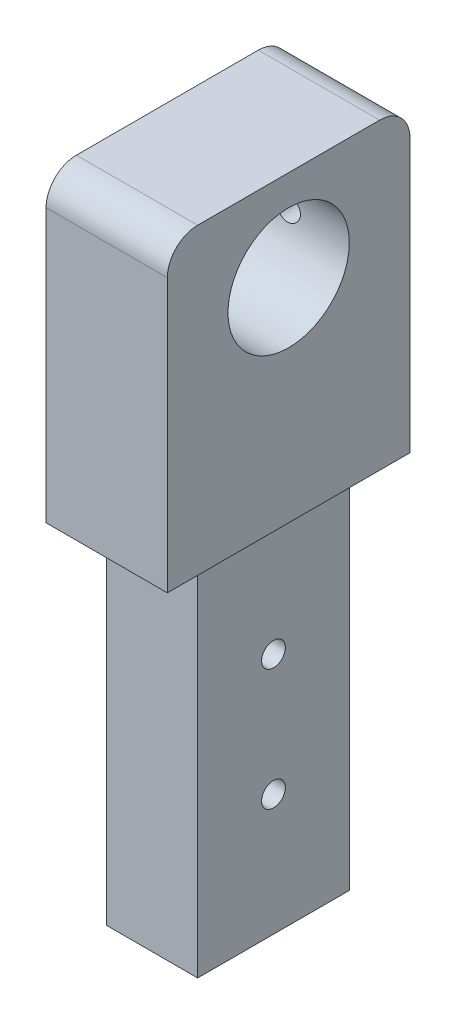
ISO-10303-21;
HEADER;
FILE_DESCRIPTION(('STEP AP214'),'2;1');
FILE_NAME('part.step','',(''),(''),'','','');
FILE_SCHEMA(('AUTOMOTIVE_DESIGN { 1 0 10303 214 1 1 1 1 }'));
ENDSEC;
DATA;
#1=APPLICATION_CONTEXT('core data for automotive mechanical design processes');
#2=APPLICATION_PROTOCOL_DEFINITION('international standard','automotive_design',2000,#1);
#3=PRODUCT_CONTEXT('',#1,'mechanical');
#4=PRODUCT('Part','Part','',(#3));
#5=PRODUCT_RELATED_PRODUCT_CATEGORY('part','',(#4));
#6=PRODUCT_DEFINITION_FORMATION('','',#4);
#7=PRODUCT_DEFINITION_CONTEXT('part definition',#1,'design');
#8=PRODUCT_DEFINITION('design','',#6,#7);
#9=PRODUCT_DEFINITION_SHAPE('','',#8);
#10=(LENGTH_UNIT() NAMED_UNIT(*) SI_UNIT(.MILLI.,.METRE.));
#11=(NAMED_UNIT(*) PLANE_ANGLE_UNIT() SI_UNIT($,.RADIAN.));
#12=(NAMED_UNIT(*) SI_UNIT($,.STERADIAN.) SOLID_ANGLE_UNIT());
#13=UNCERTAINTY_MEASURE_WITH_UNIT(LENGTH_MEASURE(1.E-05),#10,'distance_accuracy_value','');
#14=(GEOMETRIC_REPRESENTATION_CONTEXT(3) GLOBAL_UNCERTAINTY_ASSIGNED_CONTEXT((#13)) GLOBAL_UNIT_ASSIGNED_CONTEXT((#10,
#11,#12)) REPRESENTATION_CONTEXT('',''));
#15=CARTESIAN_POINT('',(0.,0.,0.));
#16=DIRECTION('',(0.,0.,1.));
#17=DIRECTION('',(1.,0.,0.));
#18=AXIS2_PLACEMENT_3D('',#15,#16,#17);
#19=CARTESIAN_POINT('',(9.525,76.2,15.875));
#20=DIRECTION('',(-1.,0.,0.));
#21=DIRECTION('',(0.,0.,1.));
#22=AXIS2_PLACEMENT_3D('',#19,#20,#21);
#23=PLANE('',#22);
#24=CARTESIAN_POINT('',(9.525,25.4,0.));
#25=DIRECTION('',(-1.,0.,0.));
#26=DIRECTION('',(0.,0.,1.));
#27=AXIS2_PLACEMENT_3D('',#24,#25,#26);
#28=CIRCLE('',#27,2.4892);
#29=CARTESIAN_POINT('',(9.525,25.4,2.4892));
#30=VERTEX_POINT('',#29);
#31=EDGE_CURVE('E302',#30,#30,#28,.F.);
#32=ORIENTED_EDGE('',*,*,#31,.F.);
#33=EDGE_LOOP('',(#32));
#34=FACE_BOUND('',#33,.T.);
#35=CARTESIAN_POINT('',(9.525,50.8,0.));
#36=DIRECTION('',(-1.,0.,0.));
#37=DIRECTION('',(0.,0.,1.));
#38=AXIS2_PLACEMENT_3D('',#35,#36,#37);
#39=CIRCLE('',#38,2.4892);
#40=CARTESIAN_POINT('',(9.525,50.8,2.4892));
#41=VERTEX_POINT('',#40);
#42=EDGE_CURVE('E297',#41,#41,#39,.F.);
#43=ORIENTED_EDGE('',*,*,#42,.F.);
#44=EDGE_LOOP('',(#43));
#45=FACE_BOUND('',#44,.T.);
#46=DIRECTION('',(0.,0.,-1.));
#47=VECTOR('',#46,1.);
#48=CARTESIAN_POINT('',(9.525,0.,15.875));
#49=LINE('',#48,#47);
#50=CARTESIAN_POINT('',(9.525,0.,15.875));
#51=VERTEX_POINT('',#50);
#52=CARTESIAN_POINT('',(9.525,0.,-15.875));
#53=VERTEX_POINT('',#52);
#54=EDGE_CURVE('E121',#51,#53,#49,.T.);
#55=ORIENTED_EDGE('',*,*,#54,.T.);
#56=DIRECTION('',(0.,-1.,0.));
#57=VECTOR('',#56,1.);
#58=CARTESIAN_POINT('',(9.525,76.2,-15.875));
#59=LINE('',#58,#57);
#60=CARTESIAN_POINT('',(9.525,76.2,-15.875));
#61=VERTEX_POINT('',#60);
#62=EDGE_CURVE('E182',#61,#53,#59,.T.);
#63=ORIENTED_EDGE('',*,*,#62,.F.);
#64=DIRECTION('',(0.,0.,-1.));
#65=VECTOR('',#64,1.);
#66=CARTESIAN_POINT('',(9.525,76.2,15.875));
#67=LINE('',#66,#65);
#68=CARTESIAN_POINT('',(9.525,76.2,15.875));
#69=VERTEX_POINT('',#68);
#70=EDGE_CURVE('E153',#69,#61,#67,.T.);
#71=ORIENTED_EDGE('',*,*,#70,.F.);
#72=DIRECTION('',(0.,-1.,0.));
#73=VECTOR('',#72,1.);
#74=CARTESIAN_POINT('',(9.525,76.2,15.875));
#75=LINE('',#74,#73);
#76=EDGE_CURVE('E166',#69,#51,#75,.T.);
#77=ORIENTED_EDGE('',*,*,#76,.T.);
#78=EDGE_LOOP('',(#55,#63,#71,#77));
#79=FACE_BOUND('',#78,.T.);
#80=ADVANCED_FACE('F39',(#34,#45,#79),#23,.F.);
#81=CARTESIAN_POINT('',(-9.525,76.2,-15.875));
#82=DIRECTION('',(0.,0.,1.));
#83=DIRECTION('',(1.,0.,0.));
#84=AXIS2_PLACEMENT_3D('',#81,#82,#83);
#85=PLANE('',#84);
#86=DIRECTION('',(-1.,0.,0.));
#87=VECTOR('',#86,1.);
#88=CARTESIAN_POINT('',(-9.525,0.,-15.875));
#89=LINE('',#88,#87);
#90=CARTESIAN_POINT('',(-9.525,0.,-15.875));
#91=VERTEX_POINT('',#90);
#92=EDGE_CURVE('E169',#53,#91,#89,.T.);
#93=ORIENTED_EDGE('',*,*,#92,.T.);
#94=DIRECTION('',(0.,-1.,0.));
#95=VECTOR('',#94,1.);
#96=CARTESIAN_POINT('',(-9.525,76.2,-15.875));
#97=LINE('',#96,#95);
#98=CARTESIAN_POINT('',(-9.525,76.2,-15.875));
#99=VERTEX_POINT('',#98);
#100=EDGE_CURVE('E179',#99,#91,#97,.T.);
#101=ORIENTED_EDGE('',*,*,#100,.F.);
#102=DIRECTION('',(-1.,0.,0.));
#103=VECTOR('',#102,1.);
#104=CARTESIAN_POINT('',(-9.525,76.2,-15.875));
#105=LINE('',#104,#103);
#106=EDGE_CURVE('E156',#61,#99,#105,.T.);
#107=ORIENTED_EDGE('',*,*,#106,.F.);
#108=ORIENTED_EDGE('',*,*,#62,.T.);
#109=EDGE_LOOP('',(#93,#101,#107,#108));
#110=FACE_BOUND('',#109,.T.);
#111=ADVANCED_FACE('F225',(#110),#85,.F.);
#112=CARTESIAN_POINT('',(-9.525,76.2,15.875));
#113=DIRECTION('',(1.,0.,0.));
#114=DIRECTION('',(0.,0.,-1.));
#115=AXIS2_PLACEMENT_3D('',#112,#113,#114);
#116=PLANE('',#115);
#117=CARTESIAN_POINT('',(-9.525,25.4,0.));
#118=DIRECTION('',(-1.,0.,0.));
#119=DIRECTION('',(0.,0.,1.));
#120=AXIS2_PLACEMENT_3D('',#117,#118,#119);
#121=CIRCLE('',#120,2.4892);
#122=CARTESIAN_POINT('',(-9.525,25.4,2.4892));
#123=VERTEX_POINT('',#122);
#124=EDGE_CURVE('E284',#123,#123,#121,.T.);
#125=ORIENTED_EDGE('',*,*,#124,.F.);
#126=EDGE_LOOP('',(#125));
#127=FACE_BOUND('',#126,.T.);
#128=CARTESIAN_POINT('',(-9.525,50.8,0.));
#129=DIRECTION('',(-1.,0.,0.));
#130=DIRECTION('',(0.,0.,1.));
#131=AXIS2_PLACEMENT_3D('',#128,#129,#130);
#132=CIRCLE('',#131,2.4892);
#133=CARTESIAN_POINT('',(-9.525,50.8,2.4892));
#134=VERTEX_POINT('',#133);
#135=EDGE_CURVE('E288',#134,#134,#132,.T.);
#136=ORIENTED_EDGE('',*,*,#135,.F.);
#137=EDGE_LOOP('',(#136));
#138=FACE_BOUND('',#137,.T.);
#139=DIRECTION('',(0.,0.,1.));
#140=VECTOR('',#139,1.);
#141=CARTESIAN_POINT('',(-9.525,0.,15.875));
#142=LINE('',#141,#140);
#143=CARTESIAN_POINT('',(-9.525,0.,15.875));
#144=VERTEX_POINT('',#143);
#145=EDGE_CURVE('E171',#91,#144,#142,.T.);
#146=ORIENTED_EDGE('',*,*,#145,.T.);
#147=DIRECTION('',(0.,-1.,0.));
#148=VECTOR('',#147,1.);
#149=CARTESIAN_POINT('',(-9.525,76.2,15.875));
#150=LINE('',#149,#148);
#151=CARTESIAN_POINT('',(-9.525,76.2,15.875));
#152=VERTEX_POINT('',#151);
#153=EDGE_CURVE('E176',#152,#144,#150,.T.);
#154=ORIENTED_EDGE('',*,*,#153,.F.);
#155=DIRECTION('',(0.,0.,1.));
#156=VECTOR('',#155,1.);
#157=CARTESIAN_POINT('',(-9.525,76.2,15.875));
#158=LINE('',#157,#156);
#159=EDGE_CURVE('E160',#99,#152,#158,.T.);
#160=ORIENTED_EDGE('',*,*,#159,.F.);
#161=ORIENTED_EDGE('',*,*,#100,.T.);
#162=EDGE_LOOP('',(#146,#154,#160,#161));
#163=FACE_BOUND('',#162,.T.);
#164=ADVANCED_FACE('F233',(#127,#138,#163),#116,.F.);
#165=CARTESIAN_POINT('',(-9.525,76.2,15.875));
#166=DIRECTION('',(0.,0.,-1.));
#167=DIRECTION('',(-1.,0.,0.));
#168=AXIS2_PLACEMENT_3D('',#165,#166,#167);
#169=PLANE('',#168);
#170=DIRECTION('',(1.,0.,0.));
#171=VECTOR('',#170,1.);
#172=CARTESIAN_POINT('',(-9.525,0.,15.875));
#173=LINE('',#172,#171);
#174=EDGE_CURVE('E157',#144,#51,#173,.T.);
#175=ORIENTED_EDGE('',*,*,#174,.T.);
#176=ORIENTED_EDGE('',*,*,#76,.F.);
#177=DIRECTION('',(1.,0.,0.));
#178=VECTOR('',#177,1.);
#179=CARTESIAN_POINT('',(-9.525,76.2,15.875));
#180=LINE('',#179,#178);
#181=EDGE_CURVE('E163',#152,#69,#180,.T.);
#182=ORIENTED_EDGE('',*,*,#181,.F.);
#183=ORIENTED_EDGE('',*,*,#153,.T.);
#184=EDGE_LOOP('',(#175,#176,#182,#183));
#185=FACE_BOUND('',#184,.T.);
#186=ADVANCED_FACE('F268',(#185),#169,.F.);
#187=CARTESIAN_POINT('',(0.,0.,0.));
#188=DIRECTION('',(0.,-1.,0.));
#189=DIRECTION('',(0.,0.,-1.));
#190=AXIS2_PLACEMENT_3D('',#187,#188,#189);
#191=PLANE('',#190);
#192=ORIENTED_EDGE('',*,*,#54,.F.);
#193=ORIENTED_EDGE('',*,*,#174,.F.);
#194=ORIENTED_EDGE('',*,*,#145,.F.);
#195=ORIENTED_EDGE('',*,*,#92,.F.);
#196=EDGE_LOOP('',(#192,#193,#194,#195));
#197=FACE_BOUND('',#196,.T.);
#198=ADVANCED_FACE('F261',(#197),#191,.T.);
#199=CARTESIAN_POINT('',(0.,76.2,0.));
#200=DIRECTION('',(0.,-1.,0.));
#201=DIRECTION('',(0.,0.,-1.));
#202=AXIS2_PLACEMENT_3D('',#199,#200,#201);
#203=PLANE('',#202);
#204=DIRECTION('',(0.,0.,-1.));
#205=VECTOR('',#204,1.);
#206=CARTESIAN_POINT('',(12.7,76.2,25.4));
#207=LINE('',#206,#205);
#208=CARTESIAN_POINT('',(12.7,76.2,25.4));
#209=VERTEX_POINT('',#208);
#210=CARTESIAN_POINT('',(12.7,76.2,-25.4));
#211=VERTEX_POINT('',#210);
#212=EDGE_CURVE('E129',#209,#211,#207,.T.);
#213=ORIENTED_EDGE('',*,*,#212,.F.);
#214=DIRECTION('',(1.,0.,0.));
#215=VECTOR('',#214,1.);
#216=CARTESIAN_POINT('',(-12.7,76.2,25.4));
#217=LINE('',#216,#215);
#218=CARTESIAN_POINT('',(-12.7,76.2,25.4));
#219=VERTEX_POINT('',#218);
#220=EDGE_CURVE('E146',#219,#209,#217,.T.);
#221=ORIENTED_EDGE('',*,*,#220,.F.);
#222=DIRECTION('',(0.,0.,1.));
#223=VECTOR('',#222,1.);
#224=CARTESIAN_POINT('',(-12.7,76.2,25.4));
#225=LINE('',#224,#223);
#226=CARTESIAN_POINT('',(-12.7,76.2,-25.4));
#227=VERTEX_POINT('',#226);
#228=EDGE_CURVE('E131',#227,#219,#225,.T.);
#229=ORIENTED_EDGE('',*,*,#228,.F.);
#230=DIRECTION('',(-1.,0.,0.));
#231=VECTOR('',#230,1.);
#232=CARTESIAN_POINT('',(-12.7,76.2,-25.4));
#233=LINE('',#232,#231);
#234=EDGE_CURVE('E117',#211,#227,#233,.T.);
#235=ORIENTED_EDGE('',*,*,#234,.F.);
#236=EDGE_LOOP('',(#213,#221,#229,#235));
#237=FACE_BOUND('',#236,.T.);
#238=ORIENTED_EDGE('',*,*,#70,.T.);
#239=ORIENTED_EDGE('',*,*,#106,.T.);
#240=ORIENTED_EDGE('',*,*,#159,.T.);
#241=ORIENTED_EDGE('',*,*,#181,.T.);
#242=EDGE_LOOP('',(#238,#239,#240,#241));
#243=FACE_BOUND('',#242,.T.);
#244=ADVANCED_FACE('F126',(#237,#243),#203,.T.);
#245=CARTESIAN_POINT('',(12.7,139.7,25.4));
#246=DIRECTION('',(-1.,0.,0.));
#247=DIRECTION('',(0.,0.,1.));
#248=AXIS2_PLACEMENT_3D('',#245,#246,#247);
#249=PLANE('',#248);
#250=CARTESIAN_POINT('',(12.7,120.65,0.));
#251=DIRECTION('',(1.,0.,0.));
#252=DIRECTION('',(0.,0.,-1.));
#253=AXIS2_PLACEMENT_3D('',#250,#251,#252);
#254=CIRCLE('',#253,12.7);
#255=CARTESIAN_POINT('',(12.7,120.65,-12.7));
#256=VERTEX_POINT('',#255);
#257=EDGE_CURVE('E139',#256,#256,#254,.T.);
#258=ORIENTED_EDGE('',*,*,#257,.F.);
#259=EDGE_LOOP('',(#258));
#260=FACE_BOUND('',#259,.T.);
#261=DIRECTION('',(0.,-1.,0.));
#262=VECTOR('',#261,1.);
#263=CARTESIAN_POINT('',(12.7,139.7,-25.4));
#264=LINE('',#263,#262);
#265=CARTESIAN_POINT('',(12.7,133.35,-25.4));
#266=VERTEX_POINT('',#265);
#267=EDGE_CURVE('E114',#266,#211,#264,.T.);
#268=ORIENTED_EDGE('',*,*,#267,.F.);
#269=CARTESIAN_POINT('',(12.7,133.35,-19.05));
#270=DIRECTION('',(-1.,0.,0.));
#271=DIRECTION('',(0.,0.,1.));
#272=AXIS2_PLACEMENT_3D('',#269,#270,#271);
#273=CIRCLE('',#272,6.35);
#274=CARTESIAN_POINT('',(12.7,139.7,-19.05));
#275=VERTEX_POINT('',#274);
#276=EDGE_CURVE('E47',#266,#275,#273,.F.);
#277=ORIENTED_EDGE('',*,*,#276,.T.);
#278=DIRECTION('',(0.,0.,-1.));
#279=VECTOR('',#278,1.);
#280=CARTESIAN_POINT('',(12.7,139.7,25.4));
#281=LINE('',#280,#279);
#282=CARTESIAN_POINT('',(12.7,139.7,19.05));
#283=VERTEX_POINT('',#282);
#284=EDGE_CURVE('E148',#283,#275,#281,.T.);
#285=ORIENTED_EDGE('',*,*,#284,.F.);
#286=CARTESIAN_POINT('',(12.7,133.35,19.05));
#287=DIRECTION('',(-1.,0.,0.));
#288=DIRECTION('',(0.,0.,1.));
#289=AXIS2_PLACEMENT_3D('',#286,#287,#288);
#290=CIRCLE('',#289,6.35);
#291=CARTESIAN_POINT('',(12.7,133.35,25.4));
#292=VERTEX_POINT('',#291);
#293=EDGE_CURVE('E54',#283,#292,#290,.F.);
#294=ORIENTED_EDGE('',*,*,#293,.T.);
#295=DIRECTION('',(0.,-1.,0.));
#296=VECTOR('',#295,1.);
#297=CARTESIAN_POINT('',(12.7,139.7,25.4));
#298=LINE('',#297,#296);
#299=EDGE_CURVE('E134',#292,#209,#298,.T.);
#300=ORIENTED_EDGE('',*,*,#299,.T.);
#301=ORIENTED_EDGE('',*,*,#212,.T.);
#302=EDGE_LOOP('',(#268,#277,#285,#294,#300,#301));
#303=FACE_BOUND('',#302,.T.);
#304=ADVANCED_FACE('F133',(#260,#303),#249,.F.);
#305=CARTESIAN_POINT('',(-12.7,139.7,-25.4));
#306=DIRECTION('',(0.,0.,1.));
#307=DIRECTION('',(1.,0.,0.));
#308=AXIS2_PLACEMENT_3D('',#305,#306,#307);
#309=PLANE('',#308);
#310=CARTESIAN_POINT('',(0.,120.65,-25.4));
#311=DIRECTION('',(0.,0.,-1.));
#312=DIRECTION('',(-1.,0.,0.));
#313=AXIS2_PLACEMENT_3D('',#310,#311,#312);
#314=CIRCLE('',#313,2.4892);
#315=CARTESIAN_POINT('',(-2.4892,120.65,-25.4));
#316=VERTEX_POINT('',#315);
#317=EDGE_CURVE('E305',#316,#316,#314,.T.);
#318=ORIENTED_EDGE('',*,*,#317,.F.);
#319=EDGE_LOOP('',(#318));
#320=FACE_BOUND('',#319,.T.);
#321=DIRECTION('',(0.,-1.,0.));
#322=VECTOR('',#321,1.);
#323=CARTESIAN_POINT('',(-12.7,139.7,-25.4));
#324=LINE('',#323,#322);
#325=CARTESIAN_POINT('',(-12.7,133.35,-25.4));
#326=VERTEX_POINT('',#325);
#327=EDGE_CURVE('E122',#326,#227,#324,.T.);
#328=ORIENTED_EDGE('',*,*,#327,.F.);
#329=DIRECTION('',(-1.,0.,0.));
#330=VECTOR('',#329,1.);
#331=CARTESIAN_POINT('',(-12.7,133.35,-25.4));
#332=LINE('',#331,#330);
#333=EDGE_CURVE('E62',#326,#266,#332,.F.);
#334=ORIENTED_EDGE('',*,*,#333,.T.);
#335=ORIENTED_EDGE('',*,*,#267,.T.);
#336=ORIENTED_EDGE('',*,*,#234,.T.);
#337=EDGE_LOOP('',(#328,#334,#335,#336));
#338=FACE_BOUND('',#337,.T.);
#339=ADVANCED_FACE('F116',(#320,#338),#309,.F.);
#340=CARTESIAN_POINT('',(-12.7,139.7,25.4));
#341=DIRECTION('',(1.,0.,0.));
#342=DIRECTION('',(0.,0.,-1.));
#343=AXIS2_PLACEMENT_3D('',#340,#341,#342);
#344=PLANE('',#343);
#345=CARTESIAN_POINT('',(-12.7,120.65,0.));
#346=DIRECTION('',(1.,0.,0.));
#347=DIRECTION('',(0.,0.,-1.));
#348=AXIS2_PLACEMENT_3D('',#345,#346,#347);
#349=CIRCLE('',#348,12.7);
#350=CARTESIAN_POINT('',(-12.7,120.65,-12.7));
#351=VERTEX_POINT('',#350);
#352=EDGE_CURVE('E136',#351,#351,#349,.T.);
#353=ORIENTED_EDGE('',*,*,#352,.T.);
#354=EDGE_LOOP('',(#353));
#355=FACE_BOUND('',#354,.T.);
#356=DIRECTION('',(0.,0.,1.));
#357=VECTOR('',#356,1.);
#358=CARTESIAN_POINT('',(-12.7,139.7,25.4));
#359=LINE('',#358,#357);
#360=CARTESIAN_POINT('',(-12.7,139.7,-19.05));
#361=VERTEX_POINT('',#360);
#362=CARTESIAN_POINT('',(-12.7,139.7,19.05));
#363=VERTEX_POINT('',#362);
#364=EDGE_CURVE('E142',#361,#363,#359,.T.);
#365=ORIENTED_EDGE('',*,*,#364,.F.);
#366=CARTESIAN_POINT('',(-12.7,133.35,-19.05));
#367=DIRECTION('',(1.,0.,0.));
#368=DIRECTION('',(0.,0.,-1.));
#369=AXIS2_PLACEMENT_3D('',#366,#367,#368);
#370=CIRCLE('',#369,6.35);
#371=EDGE_CURVE('E193',#361,#326,#370,.F.);
#372=ORIENTED_EDGE('',*,*,#371,.T.);
#373=ORIENTED_EDGE('',*,*,#327,.T.);
#374=ORIENTED_EDGE('',*,*,#228,.T.);
#375=DIRECTION('',(0.,-1.,0.));
#376=VECTOR('',#375,1.);
#377=CARTESIAN_POINT('',(-12.7,139.7,25.4));
#378=LINE('',#377,#376);
#379=CARTESIAN_POINT('',(-12.7,133.35,25.4));
#380=VERTEX_POINT('',#379);
#381=EDGE_CURVE('E150',#380,#219,#378,.T.);
#382=ORIENTED_EDGE('',*,*,#381,.F.);
#383=CARTESIAN_POINT('',(-12.7,133.35,19.05));
#384=DIRECTION('',(1.,0.,0.));
#385=DIRECTION('',(0.,0.,-1.));
#386=AXIS2_PLACEMENT_3D('',#383,#384,#385);
#387=CIRCLE('',#386,6.35);
#388=EDGE_CURVE('E191',#380,#363,#387,.F.);
#389=ORIENTED_EDGE('',*,*,#388,.T.);
#390=EDGE_LOOP('',(#365,#372,#373,#374,#382,#389));
#391=FACE_BOUND('',#390,.T.);
#392=ADVANCED_FACE('F206',(#355,#391),#344,.F.);
#393=CARTESIAN_POINT('',(-12.7,139.7,25.4));
#394=DIRECTION('',(0.,0.,-1.));
#395=DIRECTION('',(-1.,0.,0.));
#396=AXIS2_PLACEMENT_3D('',#393,#394,#395);
#397=PLANE('',#396);
#398=ORIENTED_EDGE('',*,*,#299,.F.);
#399=DIRECTION('',(1.,0.,0.));
#400=VECTOR('',#399,1.);
#401=CARTESIAN_POINT('',(-12.7,133.35,25.4));
#402=LINE('',#401,#400);
#403=EDGE_CURVE('E11',#292,#380,#402,.F.);
#404=ORIENTED_EDGE('',*,*,#403,.T.);
#405=ORIENTED_EDGE('',*,*,#381,.T.);
#406=ORIENTED_EDGE('',*,*,#220,.T.);
#407=EDGE_LOOP('',(#398,#404,#405,#406));
#408=FACE_BOUND('',#407,.T.);
#409=ADVANCED_FACE('F212',(#408),#397,.F.);
#410=CARTESIAN_POINT('',(0.,139.7,0.));
#411=DIRECTION('',(0.,-1.,0.));
#412=DIRECTION('',(0.,0.,-1.));
#413=AXIS2_PLACEMENT_3D('',#410,#411,#412);
#414=PLANE('',#413);
#415=ORIENTED_EDGE('',*,*,#284,.T.);
#416=DIRECTION('',(-1.,0.,0.));
#417=VECTOR('',#416,1.);
#418=CARTESIAN_POINT('',(0.,139.7,-19.05));
#419=LINE('',#418,#417);
#420=EDGE_CURVE('E188',#275,#361,#419,.T.);
#421=ORIENTED_EDGE('',*,*,#420,.T.);
#422=ORIENTED_EDGE('',*,*,#364,.T.);
#423=DIRECTION('',(1.,0.,0.));
#424=VECTOR('',#423,1.);
#425=CARTESIAN_POINT('',(0.,139.7,19.05));
#426=LINE('',#425,#424);
#427=EDGE_CURVE('E185',#363,#283,#426,.T.);
#428=ORIENTED_EDGE('',*,*,#427,.T.);
#429=EDGE_LOOP('',(#415,#421,#422,#428));
#430=FACE_BOUND('',#429,.T.);
#431=ADVANCED_FACE('F200',(#430),#414,.F.);
#432=CARTESIAN_POINT('',(0.,133.35,-19.05));
#433=DIRECTION('',(-1.,0.,0.));
#434=DIRECTION('',(0.,0.,1.));
#435=AXIS2_PLACEMENT_3D('',#432,#433,#434);
#436=CYLINDRICAL_SURFACE('',#435,6.35);
#437=ORIENTED_EDGE('',*,*,#276,.F.);
#438=ORIENTED_EDGE('',*,*,#333,.F.);
#439=ORIENTED_EDGE('',*,*,#371,.F.);
#440=ORIENTED_EDGE('',*,*,#420,.F.);
#441=EDGE_LOOP('',(#437,#438,#439,#440));
#442=FACE_BOUND('',#441,.T.);
#443=ADVANCED_FACE('F204',(#442),#436,.T.);
#444=CARTESIAN_POINT('',(0.,133.35,19.05));
#445=DIRECTION('',(1.,0.,0.));
#446=DIRECTION('',(0.,0.,-1.));
#447=AXIS2_PLACEMENT_3D('',#444,#445,#446);
#448=CYLINDRICAL_SURFACE('',#447,6.35);
#449=ORIENTED_EDGE('',*,*,#388,.F.);
#450=ORIENTED_EDGE('',*,*,#403,.F.);
#451=ORIENTED_EDGE('',*,*,#293,.F.);
#452=ORIENTED_EDGE('',*,*,#427,.F.);
#453=EDGE_LOOP('',(#449,#450,#451,#452));
#454=FACE_BOUND('',#453,.T.);
#455=ADVANCED_FACE('F41',(#454),#448,.T.);
#456=CARTESIAN_POINT('',(-12.7,120.65,0.));
#457=DIRECTION('',(1.,0.,0.));
#458=DIRECTION('',(0.,0.,-1.));
#459=AXIS2_PLACEMENT_3D('',#456,#457,#458);
#460=CYLINDRICAL_SURFACE('',#459,12.7);
#461=CARTESIAN_POINT('',(-2.4892,120.65,-12.7));
#462=CARTESIAN_POINT('',(-2.48919484190748,120.511600299774,-12.6999974602431));
#463=CARTESIAN_POINT('',(-2.47761844842221,120.373134779248,-12.6977143951963));
#464=CARTESIAN_POINT('',(-2.43165323761436,120.10011367842,-12.6888269596265));
#465=CARTESIAN_POINT('',(-2.39724592789631,119.965561359995,-12.6822190861905));
#466=CARTESIAN_POINT('',(-2.30671945910536,119.70435391168,-12.6654203262061));
#467=CARTESIAN_POINT('',(-2.25062070970225,119.577691487811,-12.6552328085969));
#468=CARTESIAN_POINT('',(-2.11836357333566,119.335586305075,-12.6323838664457));
#469=CARTESIAN_POINT('',(-2.04220652041085,119.220142800759,-12.619722606442));
#470=CARTESIAN_POINT('',(-1.87094196765839,119.002238309715,-12.5931364937219));
#471=CARTESIAN_POINT('',(-1.77562361379251,118.89994461871,-12.5791986150265));
#472=CARTESIAN_POINT('',(-1.56919556751182,118.712691661141,-12.551725538483));
#473=CARTESIAN_POINT('',(-1.45808467594848,118.627733712097,-12.5381903713077));
#474=CARTESIAN_POINT('',(-1.2220290808615,118.476857103448,-12.5129282181477));
#475=CARTESIAN_POINT('',(-1.09697233975905,118.411110677172,-12.5012180038576));
#476=CARTESIAN_POINT('',(-0.837319949258927,118.301626533149,-12.4811161569897));
#477=CARTESIAN_POINT('',(-0.702725204201515,118.257886732034,-12.4727242102873));
#478=CARTESIAN_POINT('',(-0.429614206560237,118.194198541982,-12.4603406376225));
#479=CARTESIAN_POINT('',(-0.291168772953878,118.173957202164,-12.4562948771756));
#480=CARTESIAN_POINT('',(-0.0127923445752724,118.156930784631,-12.4528987240918));
#481=CARTESIAN_POINT('',(0.127138503081416,118.160143405281,-12.4535478707241));
#482=CARTESIAN_POINT('',(0.402377197309359,118.189696634693,-12.4594189680852));
#483=CARTESIAN_POINT('',(0.537722630058401,118.215702304075,-12.4645746925785));
#484=CARTESIAN_POINT('',(0.802091571296597,118.289575131886,-12.4787738309681));
#485=CARTESIAN_POINT('',(0.931114788389083,118.337443296929,-12.4878174238725));
#486=CARTESIAN_POINT('',(1.18014687455987,118.454004655005,-12.508841519712));
#487=CARTESIAN_POINT('',(1.30009157854065,118.522831416143,-12.5208407622679));
#488=CARTESIAN_POINT('',(1.52685509238107,118.679261913282,-12.5464119975661));
#489=CARTESIAN_POINT('',(1.63367244912062,118.766867725073,-12.5599841640993));
#490=CARTESIAN_POINT('',(1.83308262005303,118.960166922374,-12.5874594559762));
#491=CARTESIAN_POINT('',(1.9253981240645,119.066146378158,-12.6013642506257));
#492=CARTESIAN_POINT('',(2.09098420650303,119.29223169938,-12.6277233363355));
#493=CARTESIAN_POINT('',(2.16425455885654,119.412337732481,-12.6401776101765));
#494=CARTESIAN_POINT('',(2.28971833890214,119.663568740136,-12.6622611647209));
#495=CARTESIAN_POINT('',(2.34188100066939,119.794709464859,-12.6718863162347));
#496=CARTESIAN_POINT('',(2.42335803275034,120.064123120985,-12.6871956169165));
#497=CARTESIAN_POINT('',(2.45267505927829,120.202395221245,-12.6928802242349));
#498=CARTESIAN_POINT('',(2.48723817507114,120.479762658875,-12.6996044158146));
#499=CARTESIAN_POINT('',(2.49286391463367,120.618808967325,-12.7007172550017));
#500=CARTESIAN_POINT('',(2.48090587815006,120.895854976068,-12.6983756302101));
#501=CARTESIAN_POINT('',(2.4633233528812,121.033854732361,-12.6949214123666));
#502=CARTESIAN_POINT('',(2.40576338174184,121.303672273583,-12.6838795605297));
#503=CARTESIAN_POINT('',(2.36597985480884,121.435533020731,-12.6763277334933));
#504=CARTESIAN_POINT('',(2.26535842233329,121.690712396297,-12.6579341993583));
#505=CARTESIAN_POINT('',(2.20451898652903,121.81403040308,-12.6470922531539));
#506=CARTESIAN_POINT('',(2.06268524404187,122.050231136976,-12.6231385549955));
#507=CARTESIAN_POINT('',(1.9814612524933,122.162973322614,-12.6100014936067));
#508=CARTESIAN_POINT('',(1.80147265180502,122.373363748285,-12.5829761464712));
#509=CARTESIAN_POINT('',(1.70270624172499,122.471010436657,-12.5690877836963));
#510=CARTESIAN_POINT('',(1.48871118514926,122.649895916114,-12.5418794806419));
#511=CARTESIAN_POINT('',(1.37326340665552,122.730874569552,-12.5285707880419));
#512=CARTESIAN_POINT('',(1.13018094128781,122.87229088822,-12.5042629919963));
#513=CARTESIAN_POINT('',(1.00254673174312,122.932729357564,-12.4932637981441));
#514=CARTESIAN_POINT('',(0.739345483502862,123.030990039882,-12.474910369601));
#515=CARTESIAN_POINT('',(0.603822625202769,123.068926983609,-12.4675376775752));
#516=CARTESIAN_POINT('',(0.328166821808176,123.12145768756,-12.4572318865569));
#517=CARTESIAN_POINT('',(0.188034453367839,123.136054356425,-12.4542982343781));
#518=CARTESIAN_POINT('',(-0.0902527383951266,123.141385865395,-12.4532325335184));
#519=CARTESIAN_POINT('',(-0.228399539406021,123.132531523283,-12.4550178168286));
#520=CARTESIAN_POINT('',(-0.50119402707975,123.092116665955,-12.4630045818054));
#521=CARTESIAN_POINT('',(-0.635841739408602,123.060556317339,-12.4692060310697));
#522=CARTESIAN_POINT('',(-0.897567687514788,122.97580538436,-12.4852901151706));
#523=CARTESIAN_POINT('',(-1.02466215447188,122.922663257468,-12.4951644990342));
#524=CARTESIAN_POINT('',(-1.26819583424554,122.796303681108,-12.5174869241072));
#525=CARTESIAN_POINT('',(-1.38463419804493,122.723084633881,-12.5299351701301));
#526=CARTESIAN_POINT('',(-1.60560007128416,122.55723828939,-12.5562568613067));
#527=CARTESIAN_POINT('',(-1.70990199862287,122.464313551018,-12.5701502621758));
#528=CARTESIAN_POINT('',(-1.90156851081727,122.262309760646,-12.5976516416518));
#529=CARTESIAN_POINT('',(-1.98892919941676,122.15322700267,-12.6112595539599));
#530=CARTESIAN_POINT('',(-2.14505391140494,121.920696606889,-12.6368165883158));
#531=CARTESIAN_POINT('',(-2.21362364185273,121.79711647403,-12.648747800562));
#532=CARTESIAN_POINT('',(-2.32891541072779,121.539990682799,-12.6694313313719));
#533=CARTESIAN_POINT('',(-2.37565741344576,121.406454260921,-12.6781865531486));
#534=CARTESIAN_POINT('',(-2.43677068587495,121.16882248299,-12.6898031704416));
#535=CARTESIAN_POINT('',(-2.45639710363381,121.066092168579,-12.6936048611273));
#536=CARTESIAN_POINT('',(-2.48261351428344,120.858920372212,-12.6987041974075));
#537=CARTESIAN_POINT('',(-2.48920389388159,120.754478941106,-12.700001917281));
#538=CARTESIAN_POINT('',(-2.4892,120.65,-12.7));
#539=B_SPLINE_CURVE_WITH_KNOTS('',3,(#461,#462,#463,#464,#465,#466,#467,#468,#469,#470,#471,
#472,#473,#474,#475,#476,#477,#478,#479,#480,#481,#482,#483,#484,#485,#486,#487,#488,#489,#490,
#491,#492,#493,#494,#495,#496,#497,#498,#499,#500,#501,#502,#503,#504,#505,#506,#507,#508,#509,
#510,#511,#512,#513,#514,#515,#516,#517,#518,#519,#520,#521,#522,#523,#524,#525,#526,#527,#528,
#529,#530,#531,#532,#533,#534,#535,#536,#537,#538),.UNSPECIFIED.,.T.,.F.,(4,2,2,2,2,2,2,2,2,2,2,
2,2,2,2,2,2,2,2,2,2,2,2,2,2,2,2,2,2,2,2,2,2,2,2,2,2,2,4),(0.,0.414816927957154,
0.829970256678586,1.24473391073845,1.65946998663872,2.07904782136568,2.49865753223618,
2.92192114104018,3.34514467190914,3.76303328785053,4.18088089519956,4.59268936034314,
5.00451678829406,5.41902573941136,5.83358053298053,6.25528991448799,6.6770043016253,
7.09933117164786,7.52160893127868,7.93709336016344,8.3525553980048,8.76444405565557,
9.17636265406274,9.59314912487867,10.0099784085984,10.4328883778873,10.8557817890423,
11.2764999907573,11.6971657589048,12.1105111996845,12.5238536076952,12.9362730262006,
13.3487252753643,13.7679135878645,14.1871981939776,14.6106671999092,15.0337481261752,
15.3469057343236,15.6600540526729),.UNSPECIFIED.);
#540=CARTESIAN_POINT('',(-2.4892,120.65,-12.7));
#541=VERTEX_POINT('',#540);
#542=EDGE_CURVE('E308',#541,#541,#539,.T.);
#543=ORIENTED_EDGE('',*,*,#542,.F.);
#544=EDGE_LOOP('',(#543));
#545=FACE_BOUND('',#544,.T.);
#546=ORIENTED_EDGE('',*,*,#352,.F.);
#547=EDGE_LOOP('',(#546));
#548=FACE_BOUND('',#547,.T.);
#549=ORIENTED_EDGE('',*,*,#257,.T.);
#550=EDGE_LOOP('',(#549));
#551=FACE_BOUND('',#550,.T.);
#552=ADVANCED_FACE('F243',(#545,#548,#551),#460,.F.);
#553=CARTESIAN_POINT('',(0.,120.65,25.401));
#554=DIRECTION('',(0.,0.,-1.));
#555=DIRECTION('',(-1.,0.,0.));
#556=AXIS2_PLACEMENT_3D('',#553,#554,#555);
#557=CYLINDRICAL_SURFACE('',#556,2.4892);
#558=ORIENTED_EDGE('',*,*,#542,.T.);
#559=EDGE_LOOP('',(#558));
#560=FACE_BOUND('',#559,.T.);
#561=ORIENTED_EDGE('',*,*,#317,.T.);
#562=EDGE_LOOP('',(#561));
#563=FACE_BOUND('',#562,.T.);
#564=ADVANCED_FACE('F248',(#560,#563),#557,.F.);
#565=CARTESIAN_POINT('',(12.701,50.8,0.));
#566=DIRECTION('',(-1.,0.,0.));
#567=DIRECTION('',(0.,0.,1.));
#568=AXIS2_PLACEMENT_3D('',#565,#566,#567);
#569=CYLINDRICAL_SURFACE('',#568,2.4892);
#570=ORIENTED_EDGE('',*,*,#135,.T.);
#571=EDGE_LOOP('',(#570));
#572=FACE_BOUND('',#571,.T.);
#573=ORIENTED_EDGE('',*,*,#42,.T.);
#574=EDGE_LOOP('',(#573));
#575=FACE_BOUND('',#574,.T.);
#576=ADVANCED_FACE('F254',(#572,#575),#569,.F.);
#577=CARTESIAN_POINT('',(12.701,25.4,0.));
#578=DIRECTION('',(-1.,0.,0.));
#579=DIRECTION('',(0.,0.,1.));
#580=AXIS2_PLACEMENT_3D('',#577,#578,#579);
#581=CYLINDRICAL_SURFACE('',#580,2.4892);
#582=ORIENTED_EDGE('',*,*,#124,.T.);
#583=EDGE_LOOP('',(#582));
#584=FACE_BOUND('',#583,.T.);
#585=ORIENTED_EDGE('',*,*,#31,.T.);
#586=EDGE_LOOP('',(#585));
#587=FACE_BOUND('',#586,.T.);
#588=ADVANCED_FACE('F317',(#584,#587),#581,.F.);
#589=CLOSED_SHELL('',(#80,#111,#164,#186,#198,#244,#304,#339,#392,#409,#431,#443,#455,#552,#564,
#576,#588));
#590=MANIFOLD_SOLID_BREP('B2',#589);
#591=ADVANCED_BREP_SHAPE_REPRESENTATION('',(#18,#590),#14);
#592=SHAPE_DEFINITION_REPRESENTATION(#9,#591);
ENDSEC;
END-ISO-10303-21;
